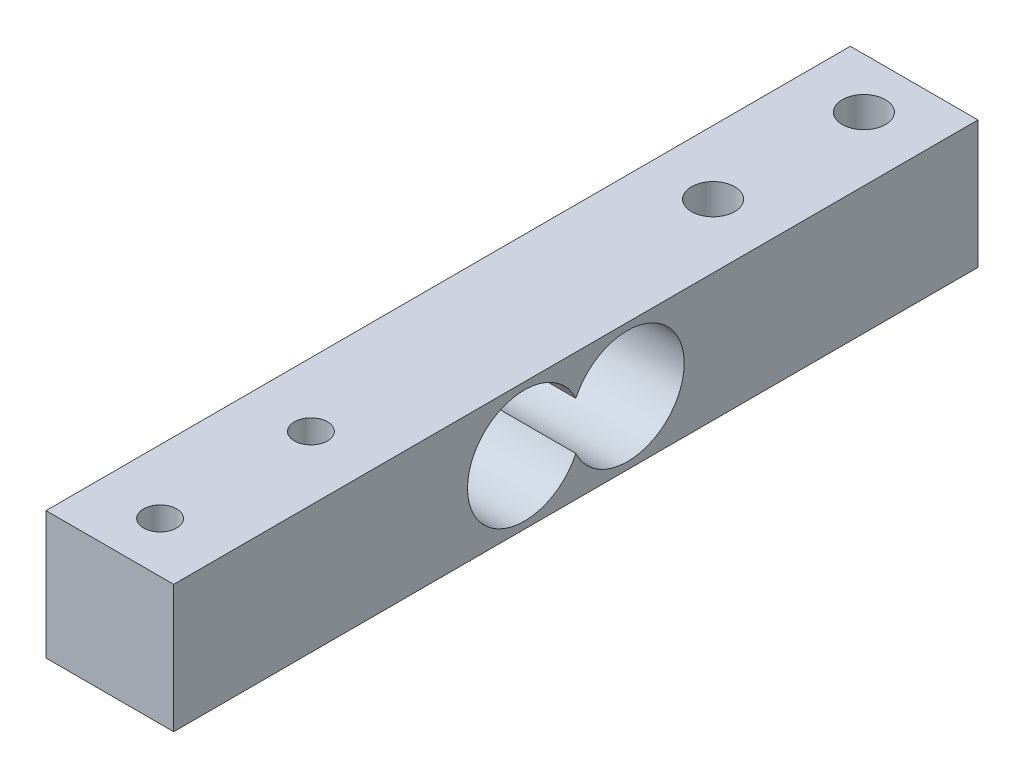
ISO-10303-21;
HEADER;
FILE_DESCRIPTION(('STEP AP214'),'2;1');
FILE_NAME('part.step','',(''),(''),'','','');
FILE_SCHEMA(('AUTOMOTIVE_DESIGN { 1 0 10303 214 1 1 1 1 }'));
ENDSEC;
DATA;
#1=APPLICATION_CONTEXT('core data for automotive mechanical design processes');
#2=APPLICATION_PROTOCOL_DEFINITION('international standard','automotive_design',2000,#1);
#3=PRODUCT_CONTEXT('',#1,'mechanical');
#4=PRODUCT('Part','Part','',(#3));
#5=PRODUCT_RELATED_PRODUCT_CATEGORY('part','',(#4));
#6=PRODUCT_DEFINITION_FORMATION('','',#4);
#7=PRODUCT_DEFINITION_CONTEXT('part definition',#1,'design');
#8=PRODUCT_DEFINITION('design','',#6,#7);
#9=PRODUCT_DEFINITION_SHAPE('','',#8);
#10=(LENGTH_UNIT() NAMED_UNIT(*) SI_UNIT(.MILLI.,.METRE.));
#11=(NAMED_UNIT(*) PLANE_ANGLE_UNIT() SI_UNIT($,.RADIAN.));
#12=(NAMED_UNIT(*) SI_UNIT($,.STERADIAN.) SOLID_ANGLE_UNIT());
#13=UNCERTAINTY_MEASURE_WITH_UNIT(LENGTH_MEASURE(1.E-05),#10,'distance_accuracy_value','');
#14=(GEOMETRIC_REPRESENTATION_CONTEXT(3) GLOBAL_UNCERTAINTY_ASSIGNED_CONTEXT((#13)) GLOBAL_UNIT_ASSIGNED_CONTEXT((#10,
#11,#12)) REPRESENTATION_CONTEXT('',''));
#15=CARTESIAN_POINT('',(0.,0.,0.));
#16=DIRECTION('',(0.,0.,1.));
#17=DIRECTION('',(1.,0.,0.));
#18=AXIS2_PLACEMENT_3D('',#15,#16,#17);
#19=CARTESIAN_POINT('',(-6.35,-6.35,40.));
#20=DIRECTION('',(0.,1.,0.));
#21=DIRECTION('',(0.,0.,1.));
#22=AXIS2_PLACEMENT_3D('',#19,#20,#21);
#23=PLANE('',#22);
#24=DIRECTION('',(1.,0.,0.));
#25=VECTOR('',#24,1.);
#26=CARTESIAN_POINT('',(-6.35,-6.35,15.));
#27=LINE('',#26,#25);
#28=CARTESIAN_POINT('',(-6.35,-6.35,15.));
#29=VERTEX_POINT('',#28);
#30=CARTESIAN_POINT('',(6.35,-6.35,15.));
#31=VERTEX_POINT('',#30);
#32=EDGE_CURVE('E11',#29,#31,#27,.T.);
#33=ORIENTED_EDGE('',*,*,#32,.F.);
#34=DIRECTION('',(0.,0.,-1.));
#35=VECTOR('',#34,1.);
#36=CARTESIAN_POINT('',(-6.35,-6.35,40.));
#37=LINE('',#36,#35);
#38=CARTESIAN_POINT('',(-6.35,-6.35,-15.));
#39=VERTEX_POINT('',#38);
#40=EDGE_CURVE('E165',#29,#39,#37,.T.);
#41=ORIENTED_EDGE('',*,*,#40,.T.);
#42=DIRECTION('',(1.,0.,0.));
#43=VECTOR('',#42,1.);
#44=CARTESIAN_POINT('',(-6.35,-6.35,-15.));
#45=LINE('',#44,#43);
#46=CARTESIAN_POINT('',(6.35,-6.35,-15.));
#47=VERTEX_POINT('',#46);
#48=EDGE_CURVE('E51',#39,#47,#45,.T.);
#49=ORIENTED_EDGE('',*,*,#48,.T.);
#50=DIRECTION('',(0.,0.,-1.));
#51=VECTOR('',#50,1.);
#52=CARTESIAN_POINT('',(6.35,-6.35,40.));
#53=LINE('',#52,#51);
#54=EDGE_CURVE('E163',#31,#47,#53,.T.);
#55=ORIENTED_EDGE('',*,*,#54,.F.);
#56=EDGE_LOOP('',(#33,#41,#49,#55));
#57=FACE_BOUND('',#56,.T.);
#58=ADVANCED_FACE('F42',(#57),#23,.F.);
#59=CARTESIAN_POINT('',(0.,-6.35,-20.));
#60=DIRECTION('',(0.,1.,0.));
#61=DIRECTION('',(0.,0.,1.));
#62=AXIS2_PLACEMENT_3D('',#59,#60,#61);
#63=CIRCLE('',#62,2.15);
#64=CARTESIAN_POINT('',(0.,-6.35,-17.85));
#65=VERTEX_POINT('',#64);
#66=EDGE_CURVE('E241',#65,#65,#63,.T.);
#67=ORIENTED_EDGE('',*,*,#66,.T.);
#68=EDGE_LOOP('',(#67));
#69=FACE_BOUND('',#68,.T.);
#70=CARTESIAN_POINT('',(0.,-6.35,-35.));
#71=DIRECTION('',(0.,1.,0.));
#72=DIRECTION('',(0.,0.,1.));
#73=AXIS2_PLACEMENT_3D('',#70,#71,#72);
#74=CIRCLE('',#73,2.15);
#75=CARTESIAN_POINT('',(0.,-6.35,-32.85));
#76=VERTEX_POINT('',#75);
#77=EDGE_CURVE('E130',#76,#76,#74,.T.);
#78=ORIENTED_EDGE('',*,*,#77,.T.);
#79=EDGE_LOOP('',(#78));
#80=FACE_BOUND('',#79,.T.);
#81=ORIENTED_EDGE('',*,*,#48,.F.);
#82=CARTESIAN_POINT('',(-6.35,-6.35,-40.));
#83=VERTEX_POINT('',#82);
#84=EDGE_CURVE('E162',#39,#83,#37,.T.);
#85=ORIENTED_EDGE('',*,*,#84,.T.);
#86=DIRECTION('',(1.,0.,0.));
#87=VECTOR('',#86,1.);
#88=CARTESIAN_POINT('',(-6.35,-6.35,-40.));
#89=LINE('',#88,#87);
#90=CARTESIAN_POINT('',(6.35,-6.35,-40.));
#91=VERTEX_POINT('',#90);
#92=EDGE_CURVE('E147',#83,#91,#89,.T.);
#93=ORIENTED_EDGE('',*,*,#92,.T.);
#94=EDGE_CURVE('E158',#47,#91,#53,.T.);
#95=ORIENTED_EDGE('',*,*,#94,.F.);
#96=EDGE_LOOP('',(#81,#85,#93,#95));
#97=FACE_BOUND('',#96,.T.);
#98=ADVANCED_FACE('F174',(#69,#80,#97),#23,.F.);
#99=CARTESIAN_POINT('',(-6.35,-6.35,40.));
#100=DIRECTION('',(1.,0.,0.));
#101=DIRECTION('',(0.,0.,-1.));
#102=AXIS2_PLACEMENT_3D('',#99,#100,#101);
#103=PLANE('',#102);
#104=CARTESIAN_POINT('',(-6.35,0.,5.1265851207212));
#105=DIRECTION('',(1.,0.,0.));
#106=DIRECTION('',(0.,0.,-1.));
#107=AXIS2_PLACEMENT_3D('',#104,#105,#106);
#108=CIRCLE('',#107,5.65);
#109=CARTESIAN_POINT('',(-6.35,2.375,0.));
#110=VERTEX_POINT('',#109);
#111=CARTESIAN_POINT('',(-6.35,-2.375,0.));
#112=VERTEX_POINT('',#111);
#113=EDGE_CURVE('E116',#110,#112,#108,.T.);
#114=ORIENTED_EDGE('',*,*,#113,.T.);
#115=CARTESIAN_POINT('',(-6.35,0.,-5.1265851207212));
#116=DIRECTION('',(1.,0.,0.));
#117=DIRECTION('',(0.,0.,-1.));
#118=AXIS2_PLACEMENT_3D('',#115,#116,#117);
#119=CIRCLE('',#118,5.65);
#120=EDGE_CURVE('E108',#112,#110,#119,.T.);
#121=ORIENTED_EDGE('',*,*,#120,.T.);
#122=EDGE_LOOP('',(#114,#121));
#123=FACE_BOUND('',#122,.T.);
#124=DIRECTION('',(0.,-1.,0.));
#125=VECTOR('',#124,1.);
#126=CARTESIAN_POINT('',(-6.35,-6.35,-40.));
#127=LINE('',#126,#125);
#128=CARTESIAN_POINT('',(-6.35,6.35,-40.));
#129=VERTEX_POINT('',#128);
#130=EDGE_CURVE('E132',#129,#83,#127,.T.);
#131=ORIENTED_EDGE('',*,*,#130,.T.);
#132=ORIENTED_EDGE('',*,*,#84,.F.);
#133=ORIENTED_EDGE('',*,*,#40,.F.);
#134=CARTESIAN_POINT('',(-6.35,-6.35,40.));
#135=VERTEX_POINT('',#134);
#136=EDGE_CURVE('E164',#135,#29,#37,.T.);
#137=ORIENTED_EDGE('',*,*,#136,.F.);
#138=DIRECTION('',(0.,-1.,0.));
#139=VECTOR('',#138,1.);
#140=CARTESIAN_POINT('',(-6.35,-6.35,40.));
#141=LINE('',#140,#139);
#142=CARTESIAN_POINT('',(-6.35,6.35,40.));
#143=VERTEX_POINT('',#142);
#144=EDGE_CURVE('E134',#143,#135,#141,.T.);
#145=ORIENTED_EDGE('',*,*,#144,.F.);
#146=DIRECTION('',(0.,0.,-1.));
#147=VECTOR('',#146,1.);
#148=CARTESIAN_POINT('',(-6.35,6.35,40.));
#149=LINE('',#148,#147);
#150=EDGE_CURVE('E144',#143,#129,#149,.T.);
#151=ORIENTED_EDGE('',*,*,#150,.T.);
#152=EDGE_LOOP('',(#131,#132,#133,#137,#145,#151));
#153=FACE_BOUND('',#152,.T.);
#154=ADVANCED_FACE('F44',(#123,#153),#103,.F.);
#155=CARTESIAN_POINT('',(0.,-6.35,35.));
#156=DIRECTION('',(0.,1.,0.));
#157=DIRECTION('',(0.,0.,1.));
#158=AXIS2_PLACEMENT_3D('',#155,#156,#157);
#159=CIRCLE('',#158,1.65);
#160=CARTESIAN_POINT('',(0.,-6.35,36.65));
#161=VERTEX_POINT('',#160);
#162=EDGE_CURVE('E223',#161,#161,#159,.T.);
#163=ORIENTED_EDGE('',*,*,#162,.T.);
#164=EDGE_LOOP('',(#163));
#165=FACE_BOUND('',#164,.T.);
#166=CARTESIAN_POINT('',(0.,-6.35,20.));
#167=DIRECTION('',(0.,1.,0.));
#168=DIRECTION('',(0.,0.,1.));
#169=AXIS2_PLACEMENT_3D('',#166,#167,#168);
#170=CIRCLE('',#169,1.65);
#171=CARTESIAN_POINT('',(0.,-6.35,21.65));
#172=VERTEX_POINT('',#171);
#173=EDGE_CURVE('E226',#172,#172,#170,.T.);
#174=ORIENTED_EDGE('',*,*,#173,.T.);
#175=EDGE_LOOP('',(#174));
#176=FACE_BOUND('',#175,.T.);
#177=ORIENTED_EDGE('',*,*,#136,.T.);
#178=ORIENTED_EDGE('',*,*,#32,.T.);
#179=CARTESIAN_POINT('',(6.35,-6.35,40.));
#180=VERTEX_POINT('',#179);
#181=EDGE_CURVE('E159',#180,#31,#53,.T.);
#182=ORIENTED_EDGE('',*,*,#181,.F.);
#183=DIRECTION('',(1.,0.,0.));
#184=VECTOR('',#183,1.);
#185=CARTESIAN_POINT('',(-6.35,-6.35,40.));
#186=LINE('',#185,#184);
#187=EDGE_CURVE('E137',#135,#180,#186,.T.);
#188=ORIENTED_EDGE('',*,*,#187,.F.);
#189=EDGE_LOOP('',(#177,#178,#182,#188));
#190=FACE_BOUND('',#189,.T.);
#191=ADVANCED_FACE('F181',(#165,#176,#190),#23,.F.);
#192=CARTESIAN_POINT('',(6.35,-6.35,40.));
#193=DIRECTION('',(-1.,0.,0.));
#194=DIRECTION('',(0.,0.,1.));
#195=AXIS2_PLACEMENT_3D('',#192,#193,#194);
#196=PLANE('',#195);
#197=CARTESIAN_POINT('',(6.35,0.,5.1265851207212));
#198=DIRECTION('',(1.,0.,0.));
#199=DIRECTION('',(0.,0.,-1.));
#200=AXIS2_PLACEMENT_3D('',#197,#198,#199);
#201=CIRCLE('',#200,5.65);
#202=CARTESIAN_POINT('',(6.35,2.375,0.));
#203=VERTEX_POINT('',#202);
#204=CARTESIAN_POINT('',(6.35,-2.375,0.));
#205=VERTEX_POINT('',#204);
#206=EDGE_CURVE('E123',#203,#205,#201,.T.);
#207=ORIENTED_EDGE('',*,*,#206,.F.);
#208=CARTESIAN_POINT('',(6.35,0.,-5.1265851207212));
#209=DIRECTION('',(1.,0.,0.));
#210=DIRECTION('',(0.,0.,-1.));
#211=AXIS2_PLACEMENT_3D('',#208,#209,#210);
#212=CIRCLE('',#211,5.65);
#213=EDGE_CURVE('E111',#205,#203,#212,.T.);
#214=ORIENTED_EDGE('',*,*,#213,.F.);
#215=EDGE_LOOP('',(#207,#214));
#216=FACE_BOUND('',#215,.T.);
#217=DIRECTION('',(0.,1.,0.));
#218=VECTOR('',#217,1.);
#219=CARTESIAN_POINT('',(6.35,-6.35,-40.));
#220=LINE('',#219,#218);
#221=CARTESIAN_POINT('',(6.35,6.35,-40.));
#222=VERTEX_POINT('',#221);
#223=EDGE_CURVE('E150',#91,#222,#220,.T.);
#224=ORIENTED_EDGE('',*,*,#223,.T.);
#225=DIRECTION('',(0.,0.,-1.));
#226=VECTOR('',#225,1.);
#227=CARTESIAN_POINT('',(6.35,6.35,40.));
#228=LINE('',#227,#226);
#229=CARTESIAN_POINT('',(6.35,6.35,40.));
#230=VERTEX_POINT('',#229);
#231=EDGE_CURVE('E155',#230,#222,#228,.T.);
#232=ORIENTED_EDGE('',*,*,#231,.F.);
#233=DIRECTION('',(0.,1.,0.));
#234=VECTOR('',#233,1.);
#235=CARTESIAN_POINT('',(6.35,-6.35,40.));
#236=LINE('',#235,#234);
#237=EDGE_CURVE('E140',#180,#230,#236,.T.);
#238=ORIENTED_EDGE('',*,*,#237,.F.);
#239=ORIENTED_EDGE('',*,*,#181,.T.);
#240=ORIENTED_EDGE('',*,*,#54,.T.);
#241=ORIENTED_EDGE('',*,*,#94,.T.);
#242=EDGE_LOOP('',(#224,#232,#238,#239,#240,#241));
#243=FACE_BOUND('',#242,.T.);
#244=ADVANCED_FACE('F178',(#216,#243),#196,.F.);
#245=CARTESIAN_POINT('',(-6.35,6.35,40.));
#246=DIRECTION('',(0.,-1.,0.));
#247=DIRECTION('',(0.,0.,-1.));
#248=AXIS2_PLACEMENT_3D('',#245,#246,#247);
#249=PLANE('',#248);
#250=CARTESIAN_POINT('',(0.,6.35,35.));
#251=DIRECTION('',(0.,1.,0.));
#252=DIRECTION('',(0.,0.,1.));
#253=AXIS2_PLACEMENT_3D('',#250,#251,#252);
#254=CIRCLE('',#253,1.65);
#255=CARTESIAN_POINT('',(0.,6.35,36.65));
#256=VERTEX_POINT('',#255);
#257=EDGE_CURVE('E228',#256,#256,#254,.T.);
#258=ORIENTED_EDGE('',*,*,#257,.F.);
#259=EDGE_LOOP('',(#258));
#260=FACE_BOUND('',#259,.T.);
#261=CARTESIAN_POINT('',(0.,6.35,20.));
#262=DIRECTION('',(0.,1.,0.));
#263=DIRECTION('',(0.,0.,1.));
#264=AXIS2_PLACEMENT_3D('',#261,#262,#263);
#265=CIRCLE('',#264,1.65);
#266=CARTESIAN_POINT('',(0.,6.35,21.65));
#267=VERTEX_POINT('',#266);
#268=EDGE_CURVE('E229',#267,#267,#265,.T.);
#269=ORIENTED_EDGE('',*,*,#268,.F.);
#270=EDGE_LOOP('',(#269));
#271=FACE_BOUND('',#270,.T.);
#272=CARTESIAN_POINT('',(0.,6.35,-35.));
#273=DIRECTION('',(0.,1.,0.));
#274=DIRECTION('',(0.,0.,1.));
#275=AXIS2_PLACEMENT_3D('',#272,#273,#274);
#276=CIRCLE('',#275,2.15);
#277=CARTESIAN_POINT('',(0.,6.35,-32.85));
#278=VERTEX_POINT('',#277);
#279=EDGE_CURVE('E239',#278,#278,#276,.T.);
#280=ORIENTED_EDGE('',*,*,#279,.F.);
#281=EDGE_LOOP('',(#280));
#282=FACE_BOUND('',#281,.T.);
#283=CARTESIAN_POINT('',(0.,6.35,-20.));
#284=DIRECTION('',(0.,1.,0.));
#285=DIRECTION('',(0.,0.,1.));
#286=AXIS2_PLACEMENT_3D('',#283,#284,#285);
#287=CIRCLE('',#286,2.15);
#288=CARTESIAN_POINT('',(0.,6.35,-17.85));
#289=VERTEX_POINT('',#288);
#290=EDGE_CURVE('E127',#289,#289,#287,.T.);
#291=ORIENTED_EDGE('',*,*,#290,.F.);
#292=EDGE_LOOP('',(#291));
#293=FACE_BOUND('',#292,.T.);
#294=DIRECTION('',(-1.,0.,0.));
#295=VECTOR('',#294,1.);
#296=CARTESIAN_POINT('',(-6.35,6.35,-40.));
#297=LINE('',#296,#295);
#298=EDGE_CURVE('E138',#222,#129,#297,.T.);
#299=ORIENTED_EDGE('',*,*,#298,.T.);
#300=ORIENTED_EDGE('',*,*,#150,.F.);
#301=DIRECTION('',(-1.,0.,0.));
#302=VECTOR('',#301,1.);
#303=CARTESIAN_POINT('',(-6.35,6.35,40.));
#304=LINE('',#303,#302);
#305=EDGE_CURVE('E142',#230,#143,#304,.T.);
#306=ORIENTED_EDGE('',*,*,#305,.F.);
#307=ORIENTED_EDGE('',*,*,#231,.T.);
#308=EDGE_LOOP('',(#299,#300,#306,#307));
#309=FACE_BOUND('',#308,.T.);
#310=ADVANCED_FACE('F193',(#260,#271,#282,#293,#309),#249,.F.);
#311=CARTESIAN_POINT('',(0.,0.,40.));
#312=DIRECTION('',(0.,0.,-1.));
#313=DIRECTION('',(-1.,0.,0.));
#314=AXIS2_PLACEMENT_3D('',#311,#312,#313);
#315=PLANE('',#314);
#316=ORIENTED_EDGE('',*,*,#144,.T.);
#317=ORIENTED_EDGE('',*,*,#187,.T.);
#318=ORIENTED_EDGE('',*,*,#237,.T.);
#319=ORIENTED_EDGE('',*,*,#305,.T.);
#320=EDGE_LOOP('',(#316,#317,#318,#319));
#321=FACE_BOUND('',#320,.T.);
#322=ADVANCED_FACE('F185',(#321),#315,.F.);
#323=CARTESIAN_POINT('',(0.,0.,-40.));
#324=DIRECTION('',(0.,0.,-1.));
#325=DIRECTION('',(-1.,0.,0.));
#326=AXIS2_PLACEMENT_3D('',#323,#324,#325);
#327=PLANE('',#326);
#328=ORIENTED_EDGE('',*,*,#130,.F.);
#329=ORIENTED_EDGE('',*,*,#298,.F.);
#330=ORIENTED_EDGE('',*,*,#223,.F.);
#331=ORIENTED_EDGE('',*,*,#92,.F.);
#332=EDGE_LOOP('',(#328,#329,#330,#331));
#333=FACE_BOUND('',#332,.T.);
#334=ADVANCED_FACE('F190',(#333),#327,.T.);
#335=CARTESIAN_POINT('',(-6.35,0.,-5.1265851207212));
#336=DIRECTION('',(1.,0.,0.));
#337=DIRECTION('',(0.,0.,-1.));
#338=AXIS2_PLACEMENT_3D('',#335,#336,#337);
#339=CYLINDRICAL_SURFACE('',#338,5.65);
#340=ORIENTED_EDGE('',*,*,#213,.T.);
#341=DIRECTION('',(1.,0.,0.));
#342=VECTOR('',#341,1.);
#343=CARTESIAN_POINT('',(-6.35,2.375,0.));
#344=LINE('',#343,#342);
#345=EDGE_CURVE('E104',#110,#203,#344,.T.);
#346=ORIENTED_EDGE('',*,*,#345,.F.);
#347=ORIENTED_EDGE('',*,*,#120,.F.);
#348=DIRECTION('',(1.,0.,0.));
#349=VECTOR('',#348,1.);
#350=CARTESIAN_POINT('',(-6.35,-2.375,0.));
#351=LINE('',#350,#349);
#352=EDGE_CURVE('E115',#112,#205,#351,.T.);
#353=ORIENTED_EDGE('',*,*,#352,.T.);
#354=EDGE_LOOP('',(#340,#346,#347,#353));
#355=FACE_BOUND('',#354,.T.);
#356=ADVANCED_FACE('F106',(#355),#339,.F.);
#357=CARTESIAN_POINT('',(-6.35,0.,5.1265851207212));
#358=DIRECTION('',(1.,0.,0.));
#359=DIRECTION('',(0.,0.,-1.));
#360=AXIS2_PLACEMENT_3D('',#357,#358,#359);
#361=CYLINDRICAL_SURFACE('',#360,5.65);
#362=ORIENTED_EDGE('',*,*,#206,.T.);
#363=ORIENTED_EDGE('',*,*,#352,.F.);
#364=ORIENTED_EDGE('',*,*,#113,.F.);
#365=ORIENTED_EDGE('',*,*,#345,.T.);
#366=EDGE_LOOP('',(#362,#363,#364,#365));
#367=FACE_BOUND('',#366,.T.);
#368=ADVANCED_FACE('F119',(#367),#361,.F.);
#369=CARTESIAN_POINT('',(0.,-6.35,-20.));
#370=DIRECTION('',(0.,1.,0.));
#371=DIRECTION('',(0.,0.,1.));
#372=AXIS2_PLACEMENT_3D('',#369,#370,#371);
#373=CYLINDRICAL_SURFACE('',#372,2.15);
#374=ORIENTED_EDGE('',*,*,#66,.F.);
#375=EDGE_LOOP('',(#374));
#376=FACE_BOUND('',#375,.T.);
#377=ORIENTED_EDGE('',*,*,#290,.T.);
#378=EDGE_LOOP('',(#377));
#379=FACE_BOUND('',#378,.T.);
#380=ADVANCED_FACE('F247',(#376,#379),#373,.F.);
#381=CARTESIAN_POINT('',(0.,-6.35,-35.));
#382=DIRECTION('',(0.,1.,0.));
#383=DIRECTION('',(0.,0.,1.));
#384=AXIS2_PLACEMENT_3D('',#381,#382,#383);
#385=CYLINDRICAL_SURFACE('',#384,2.15);
#386=ORIENTED_EDGE('',*,*,#77,.F.);
#387=EDGE_LOOP('',(#386));
#388=FACE_BOUND('',#387,.T.);
#389=ORIENTED_EDGE('',*,*,#279,.T.);
#390=EDGE_LOOP('',(#389));
#391=FACE_BOUND('',#390,.T.);
#392=ADVANCED_FACE('F250',(#388,#391),#385,.F.);
#393=CARTESIAN_POINT('',(0.,-6.35,20.));
#394=DIRECTION('',(0.,1.,0.));
#395=DIRECTION('',(0.,0.,1.));
#396=AXIS2_PLACEMENT_3D('',#393,#394,#395);
#397=CYLINDRICAL_SURFACE('',#396,1.65);
#398=ORIENTED_EDGE('',*,*,#173,.F.);
#399=EDGE_LOOP('',(#398));
#400=FACE_BOUND('',#399,.T.);
#401=ORIENTED_EDGE('',*,*,#268,.T.);
#402=EDGE_LOOP('',(#401));
#403=FACE_BOUND('',#402,.T.);
#404=ADVANCED_FACE('F256',(#400,#403),#397,.F.);
#405=CARTESIAN_POINT('',(0.,-6.35,35.));
#406=DIRECTION('',(0.,1.,0.));
#407=DIRECTION('',(0.,0.,1.));
#408=AXIS2_PLACEMENT_3D('',#405,#406,#407);
#409=CYLINDRICAL_SURFACE('',#408,1.65);
#410=ORIENTED_EDGE('',*,*,#162,.F.);
#411=EDGE_LOOP('',(#410));
#412=FACE_BOUND('',#411,.T.);
#413=ORIENTED_EDGE('',*,*,#257,.T.);
#414=EDGE_LOOP('',(#413));
#415=FACE_BOUND('',#414,.T.);
#416=ADVANCED_FACE('F297',(#412,#415),#409,.F.);
#417=CLOSED_SHELL('',(#58,#98,#154,#191,#244,#310,#322,#334,#356,#368,#380,#392,#404,#416));
#418=MANIFOLD_SOLID_BREP('B2',#417);
#419=ADVANCED_BREP_SHAPE_REPRESENTATION('',(#18,#418),#14);
#420=SHAPE_DEFINITION_REPRESENTATION(#9,#419);
ENDSEC;
END-ISO-10303-21;
